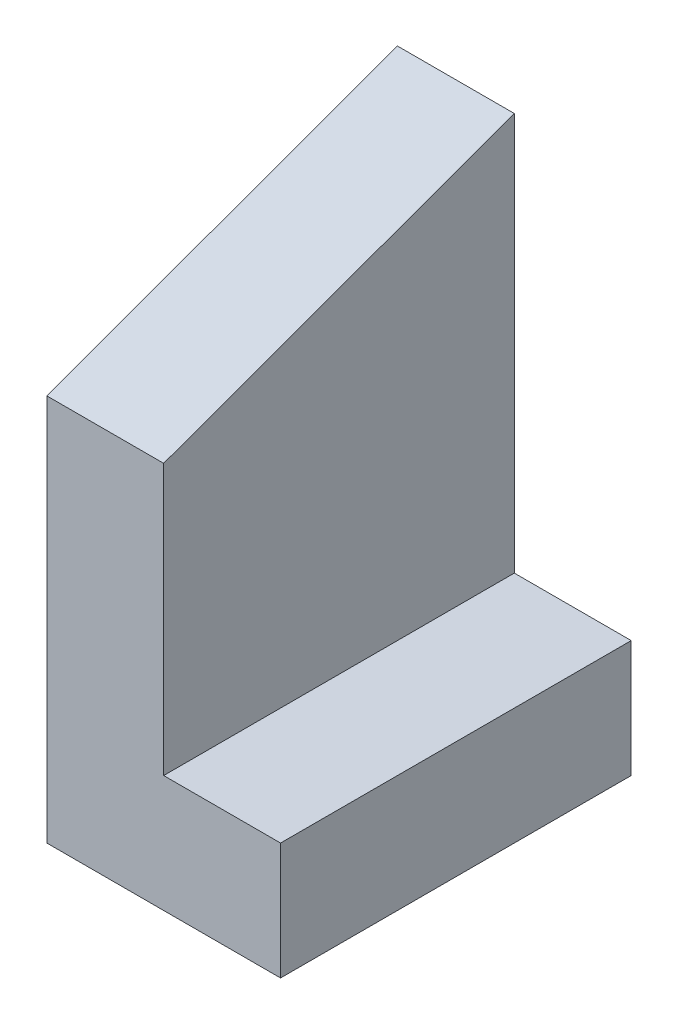
ISO-10303-21;
HEADER;
FILE_DESCRIPTION(('STEP AP214'),'2;1');
FILE_NAME('part.step','',(''),(''),'','','');
FILE_SCHEMA(('AUTOMOTIVE_DESIGN { 1 0 10303 214 1 1 1 1 }'));
ENDSEC;
DATA;
#1=APPLICATION_CONTEXT('core data for automotive mechanical design processes');
#2=APPLICATION_PROTOCOL_DEFINITION('international standard','automotive_design',2000,#1);
#3=PRODUCT_CONTEXT('',#1,'mechanical');
#4=PRODUCT('Part','Part','',(#3));
#5=PRODUCT_RELATED_PRODUCT_CATEGORY('part','',(#4));
#6=PRODUCT_DEFINITION_FORMATION('','',#4);
#7=PRODUCT_DEFINITION_CONTEXT('part definition',#1,'design');
#8=PRODUCT_DEFINITION('design','',#6,#7);
#9=PRODUCT_DEFINITION_SHAPE('','',#8);
#10=(LENGTH_UNIT() NAMED_UNIT(*) SI_UNIT(.MILLI.,.METRE.));
#11=(NAMED_UNIT(*) PLANE_ANGLE_UNIT() SI_UNIT($,.RADIAN.));
#12=(NAMED_UNIT(*) SI_UNIT($,.STERADIAN.) SOLID_ANGLE_UNIT());
#13=UNCERTAINTY_MEASURE_WITH_UNIT(LENGTH_MEASURE(1.E-05),#10,'distance_accuracy_value','');
#14=(GEOMETRIC_REPRESENTATION_CONTEXT(3) GLOBAL_UNCERTAINTY_ASSIGNED_CONTEXT((#13)) GLOBAL_UNIT_ASSIGNED_CONTEXT((#10,
#11,#12)) REPRESENTATION_CONTEXT('',''));
#15=CARTESIAN_POINT('',(0.,0.,0.));
#16=DIRECTION('',(0.,0.,1.));
#17=DIRECTION('',(1.,0.,0.));
#18=AXIS2_PLACEMENT_3D('',#15,#16,#17);
#19=CARTESIAN_POINT('',(0.,0.,15.));
#20=DIRECTION('',(0.,1.,0.));
#21=DIRECTION('',(0.,0.,1.));
#22=AXIS2_PLACEMENT_3D('',#19,#20,#21);
#23=PLANE('',#22);
#24=DIRECTION('',(1.,0.,0.));
#25=VECTOR('',#24,1.);
#26=CARTESIAN_POINT('',(0.,0.,0.));
#27=LINE('',#26,#25);
#28=CARTESIAN_POINT('',(0.,0.,0.));
#29=VERTEX_POINT('',#28);
#30=CARTESIAN_POINT('',(10.,0.,0.));
#31=VERTEX_POINT('',#30);
#32=EDGE_CURVE('E116',#29,#31,#27,.T.);
#33=ORIENTED_EDGE('',*,*,#32,.T.);
#34=DIRECTION('',(0.,0.,-1.));
#35=VECTOR('',#34,1.);
#36=CARTESIAN_POINT('',(10.,0.,15.));
#37=LINE('',#36,#35);
#38=CARTESIAN_POINT('',(10.,0.,15.));
#39=VERTEX_POINT('',#38);
#40=EDGE_CURVE('E40',#39,#31,#37,.T.);
#41=ORIENTED_EDGE('',*,*,#40,.F.);
#42=DIRECTION('',(1.,0.,0.));
#43=VECTOR('',#42,1.);
#44=CARTESIAN_POINT('',(0.,0.,15.));
#45=LINE('',#44,#43);
#46=CARTESIAN_POINT('',(0.,0.,15.));
#47=VERTEX_POINT('',#46);
#48=EDGE_CURVE('E125',#47,#39,#45,.T.);
#49=ORIENTED_EDGE('',*,*,#48,.F.);
#50=DIRECTION('',(0.,0.,-1.));
#51=VECTOR('',#50,1.);
#52=CARTESIAN_POINT('',(0.,0.,15.));
#53=LINE('',#52,#51);
#54=EDGE_CURVE('E111',#47,#29,#53,.T.);
#55=ORIENTED_EDGE('',*,*,#54,.T.);
#56=EDGE_LOOP('',(#33,#41,#49,#55));
#57=FACE_BOUND('',#56,.T.);
#58=ADVANCED_FACE('F33',(#57),#23,.F.);
#59=CARTESIAN_POINT('',(10.,5.,15.));
#60=DIRECTION('',(-1.,0.,0.));
#61=DIRECTION('',(0.,0.,1.));
#62=AXIS2_PLACEMENT_3D('',#59,#60,#61);
#63=PLANE('',#62);
#64=DIRECTION('',(0.,1.,0.));
#65=VECTOR('',#64,1.);
#66=CARTESIAN_POINT('',(10.,5.,0.));
#67=LINE('',#66,#65);
#68=CARTESIAN_POINT('',(10.,5.,0.));
#69=VERTEX_POINT('',#68);
#70=EDGE_CURVE('E119',#31,#69,#67,.T.);
#71=ORIENTED_EDGE('',*,*,#70,.T.);
#72=DIRECTION('',(0.,0.,-1.));
#73=VECTOR('',#72,1.);
#74=CARTESIAN_POINT('',(10.,5.,15.));
#75=LINE('',#74,#73);
#76=CARTESIAN_POINT('',(10.,5.,15.));
#77=VERTEX_POINT('',#76);
#78=EDGE_CURVE('E129',#77,#69,#75,.T.);
#79=ORIENTED_EDGE('',*,*,#78,.F.);
#80=DIRECTION('',(0.,1.,0.));
#81=VECTOR('',#80,1.);
#82=CARTESIAN_POINT('',(10.,5.,15.));
#83=LINE('',#82,#81);
#84=EDGE_CURVE('E85',#39,#77,#83,.T.);
#85=ORIENTED_EDGE('',*,*,#84,.F.);
#86=ORIENTED_EDGE('',*,*,#40,.T.);
#87=EDGE_LOOP('',(#71,#79,#85,#86));
#88=FACE_BOUND('',#87,.T.);
#89=ADVANCED_FACE('F132',(#88),#63,.F.);
#90=CARTESIAN_POINT('',(5.,5.,15.));
#91=DIRECTION('',(0.,-1.,0.));
#92=DIRECTION('',(0.,0.,-1.));
#93=AXIS2_PLACEMENT_3D('',#90,#91,#92);
#94=PLANE('',#93);
#95=DIRECTION('',(-1.,0.,0.));
#96=VECTOR('',#95,1.);
#97=CARTESIAN_POINT('',(5.,5.,0.));
#98=LINE('',#97,#96);
#99=CARTESIAN_POINT('',(5.,5.,0.));
#100=VERTEX_POINT('',#99);
#101=EDGE_CURVE('E121',#69,#100,#98,.T.);
#102=ORIENTED_EDGE('',*,*,#101,.T.);
#103=DIRECTION('',(0.,0.,-1.));
#104=VECTOR('',#103,1.);
#105=CARTESIAN_POINT('',(5.,5.,15.));
#106=LINE('',#105,#104);
#107=CARTESIAN_POINT('',(5.,5.,15.));
#108=VERTEX_POINT('',#107);
#109=EDGE_CURVE('E127',#108,#100,#106,.T.);
#110=ORIENTED_EDGE('',*,*,#109,.F.);
#111=DIRECTION('',(-1.,0.,0.));
#112=VECTOR('',#111,1.);
#113=CARTESIAN_POINT('',(5.,5.,15.));
#114=LINE('',#113,#112);
#115=EDGE_CURVE('E108',#77,#108,#114,.T.);
#116=ORIENTED_EDGE('',*,*,#115,.F.);
#117=ORIENTED_EDGE('',*,*,#78,.T.);
#118=EDGE_LOOP('',(#102,#110,#116,#117));
#119=FACE_BOUND('',#118,.T.);
#120=ADVANCED_FACE('F140',(#119),#94,.F.);
#121=CARTESIAN_POINT('',(5.,5.,15.));
#122=DIRECTION('',(-1.,0.,0.));
#123=DIRECTION('',(0.,0.,1.));
#124=AXIS2_PLACEMENT_3D('',#121,#122,#123);
#125=PLANE('',#124);
#126=DIRECTION('',(0.,1.,0.));
#127=VECTOR('',#126,1.);
#128=CARTESIAN_POINT('',(5.,5.,0.));
#129=LINE('',#128,#127);
#130=CARTESIAN_POINT('',(5.,22.0263170178513,0.));
#131=VERTEX_POINT('',#130);
#132=EDGE_CURVE('E104',#100,#131,#129,.T.);
#133=ORIENTED_EDGE('',*,*,#132,.T.);
#134=DIRECTION('',(0.,0.342020143325662,-0.939692620785911));
#135=VECTOR('',#134,1.);
#136=CARTESIAN_POINT('',(5.,16.5667635038584,15.));
#137=LINE('',#136,#135);
#138=CARTESIAN_POINT('',(5.,16.5667635038584,15.));
#139=VERTEX_POINT('',#138);
#140=EDGE_CURVE('E46',#139,#131,#137,.T.);
#141=ORIENTED_EDGE('',*,*,#140,.F.);
#142=DIRECTION('',(0.,1.,0.));
#143=VECTOR('',#142,1.);
#144=CARTESIAN_POINT('',(5.,5.,15.));
#145=LINE('',#144,#143);
#146=EDGE_CURVE('E102',#108,#139,#145,.T.);
#147=ORIENTED_EDGE('',*,*,#146,.F.);
#148=ORIENTED_EDGE('',*,*,#109,.T.);
#149=EDGE_LOOP('',(#133,#141,#147,#148));
#150=FACE_BOUND('',#149,.T.);
#151=ADVANCED_FACE('F100',(#150),#125,.F.);
#152=CARTESIAN_POINT('',(0.,0.,15.));
#153=DIRECTION('',(1.,0.,0.));
#154=DIRECTION('',(0.,0.,-1.));
#155=AXIS2_PLACEMENT_3D('',#152,#153,#154);
#156=PLANE('',#155);
#157=DIRECTION('',(0.,-1.,0.));
#158=VECTOR('',#157,1.);
#159=CARTESIAN_POINT('',(0.,0.,15.));
#160=LINE('',#159,#158);
#161=CARTESIAN_POINT('',(0.,16.5667635038584,15.));
#162=VERTEX_POINT('',#161);
#163=EDGE_CURVE('E55',#162,#47,#160,.T.);
#164=ORIENTED_EDGE('',*,*,#163,.F.);
#165=DIRECTION('',(0.,0.342020143325662,-0.939692620785911));
#166=VECTOR('',#165,1.);
#167=CARTESIAN_POINT('',(0.,14.6288203132278,20.3244551564436));
#168=LINE('',#167,#166);
#169=CARTESIAN_POINT('',(0.,22.0263170178513,0.));
#170=VERTEX_POINT('',#169);
#171=EDGE_CURVE('E94',#162,#170,#168,.T.);
#172=ORIENTED_EDGE('',*,*,#171,.T.);
#173=DIRECTION('',(0.,-1.,0.));
#174=VECTOR('',#173,1.);
#175=CARTESIAN_POINT('',(0.,0.,0.));
#176=LINE('',#175,#174);
#177=EDGE_CURVE('E77',#170,#29,#176,.T.);
#178=ORIENTED_EDGE('',*,*,#177,.T.);
#179=ORIENTED_EDGE('',*,*,#54,.F.);
#180=EDGE_LOOP('',(#164,#172,#178,#179));
#181=FACE_BOUND('',#180,.T.);
#182=ADVANCED_FACE('F147',(#181),#156,.F.);
#183=CARTESIAN_POINT('',(0.,0.,15.));
#184=DIRECTION('',(0.,0.,-1.));
#185=DIRECTION('',(-1.,0.,0.));
#186=AXIS2_PLACEMENT_3D('',#183,#184,#185);
#187=PLANE('',#186);
#188=ORIENTED_EDGE('',*,*,#146,.T.);
#189=DIRECTION('',(1.,0.,0.));
#190=VECTOR('',#189,1.);
#191=CARTESIAN_POINT('',(-5.,16.5667635038584,15.));
#192=LINE('',#191,#190);
#193=EDGE_CURVE('E92',#162,#139,#192,.T.);
#194=ORIENTED_EDGE('',*,*,#193,.F.);
#195=ORIENTED_EDGE('',*,*,#163,.T.);
#196=ORIENTED_EDGE('',*,*,#48,.T.);
#197=ORIENTED_EDGE('',*,*,#84,.T.);
#198=ORIENTED_EDGE('',*,*,#115,.T.);
#199=EDGE_LOOP('',(#188,#194,#195,#196,#197,#198));
#200=FACE_BOUND('',#199,.T.);
#201=ADVANCED_FACE('F106',(#200),#187,.F.);
#202=CARTESIAN_POINT('',(0.,0.,0.));
#203=DIRECTION('',(0.,0.,-1.));
#204=DIRECTION('',(-1.,0.,0.));
#205=AXIS2_PLACEMENT_3D('',#202,#203,#204);
#206=PLANE('',#205);
#207=DIRECTION('',(-1.,0.,0.));
#208=VECTOR('',#207,1.);
#209=CARTESIAN_POINT('',(0.,22.0263170178513,0.));
#210=LINE('',#209,#208);
#211=EDGE_CURVE('E11',#131,#170,#210,.T.);
#212=ORIENTED_EDGE('',*,*,#211,.F.);
#213=ORIENTED_EDGE('',*,*,#132,.F.);
#214=ORIENTED_EDGE('',*,*,#101,.F.);
#215=ORIENTED_EDGE('',*,*,#70,.F.);
#216=ORIENTED_EDGE('',*,*,#32,.F.);
#217=ORIENTED_EDGE('',*,*,#177,.F.);
#218=EDGE_LOOP('',(#212,#213,#214,#215,#216,#217));
#219=FACE_BOUND('',#218,.T.);
#220=ADVANCED_FACE('F137',(#219),#206,.T.);
#221=CARTESIAN_POINT('',(-5.,16.5667635038584,15.));
#222=DIRECTION('',(0.,-0.939692620785911,-0.342020143325662));
#223=DIRECTION('',(0.,0.342020143325662,-0.939692620785911));
#224=AXIS2_PLACEMENT_3D('',#221,#222,#223);
#225=PLANE('',#224);
#226=ORIENTED_EDGE('',*,*,#193,.T.);
#227=ORIENTED_EDGE('',*,*,#140,.T.);
#228=ORIENTED_EDGE('',*,*,#211,.T.);
#229=ORIENTED_EDGE('',*,*,#171,.F.);
#230=EDGE_LOOP('',(#226,#227,#228,#229));
#231=FACE_BOUND('',#230,.T.);
#232=ADVANCED_FACE('F93',(#231),#225,.F.);
#233=CLOSED_SHELL('',(#58,#89,#120,#151,#182,#201,#220,#232));
#234=MANIFOLD_SOLID_BREP('B2',#233);
#235=ADVANCED_BREP_SHAPE_REPRESENTATION('',(#18,#234),#14);
#236=SHAPE_DEFINITION_REPRESENTATION(#9,#235);
ENDSEC;
END-ISO-10303-21;
